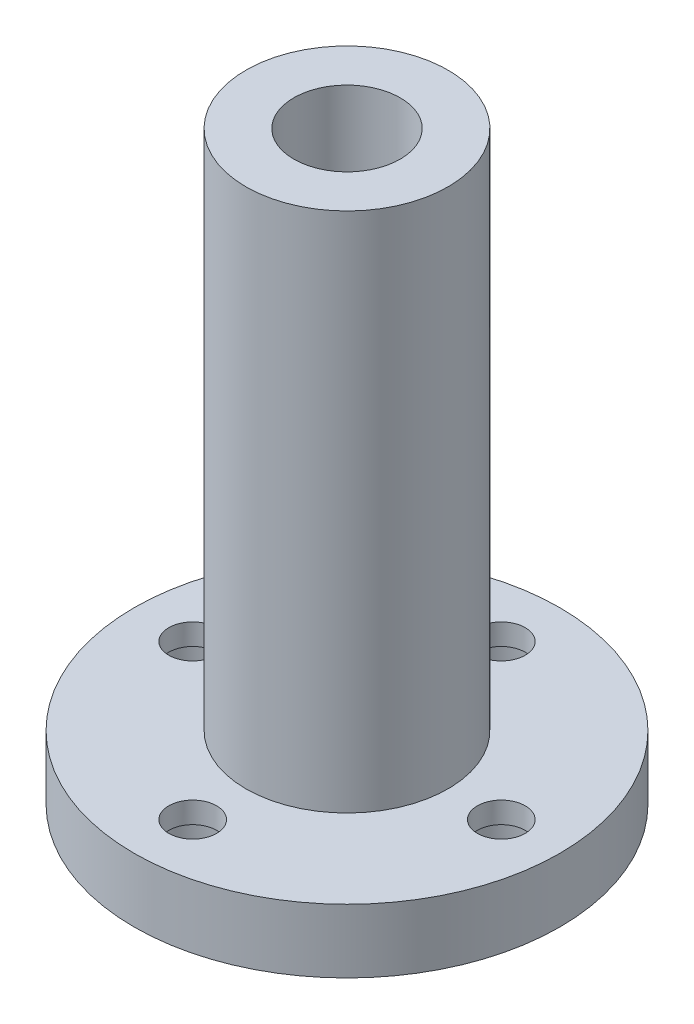
ISO-10303-21;
HEADER;
FILE_DESCRIPTION(('STEP AP214'),'2;1');
FILE_NAME('part.step','',(''),(''),'','','');
FILE_SCHEMA(('AUTOMOTIVE_DESIGN { 1 0 10303 214 1 1 1 1 }'));
ENDSEC;
DATA;
#1=APPLICATION_CONTEXT('core data for automotive mechanical design processes');
#2=APPLICATION_PROTOCOL_DEFINITION('international standard','automotive_design',2000,#1);
#3=PRODUCT_CONTEXT('',#1,'mechanical');
#4=PRODUCT('Part','Part','',(#3));
#5=PRODUCT_RELATED_PRODUCT_CATEGORY('part','',(#4));
#6=PRODUCT_DEFINITION_FORMATION('','',#4);
#7=PRODUCT_DEFINITION_CONTEXT('part definition',#1,'design');
#8=PRODUCT_DEFINITION('design','',#6,#7);
#9=PRODUCT_DEFINITION_SHAPE('','',#8);
#10=(LENGTH_UNIT() NAMED_UNIT(*) SI_UNIT(.MILLI.,.METRE.));
#11=(NAMED_UNIT(*) PLANE_ANGLE_UNIT() SI_UNIT($,.RADIAN.));
#12=(NAMED_UNIT(*) SI_UNIT($,.STERADIAN.) SOLID_ANGLE_UNIT());
#13=UNCERTAINTY_MEASURE_WITH_UNIT(LENGTH_MEASURE(1.E-05),#10,'distance_accuracy_value','');
#14=(GEOMETRIC_REPRESENTATION_CONTEXT(3) GLOBAL_UNCERTAINTY_ASSIGNED_CONTEXT((#13)) GLOBAL_UNIT_ASSIGNED_CONTEXT((#10,
#11,#12)) REPRESENTATION_CONTEXT('',''));
#15=CARTESIAN_POINT('',(0.,0.,0.));
#16=DIRECTION('',(0.,0.,1.));
#17=DIRECTION('',(1.,0.,0.));
#18=AXIS2_PLACEMENT_3D('',#15,#16,#17);
#19=CARTESIAN_POINT('',(0.,0.,-14.5));
#20=DIRECTION('',(0.,1.,0.));
#21=DIRECTION('',(0.,0.,1.));
#22=AXIS2_PLACEMENT_3D('',#19,#20,#21);
#23=CYLINDRICAL_SURFACE('',#22,2.25);
#24=CARTESIAN_POINT('',(0.,6.,-14.5));
#25=DIRECTION('',(0.,1.,0.));
#26=DIRECTION('',(0.,0.,1.));
#27=AXIS2_PLACEMENT_3D('',#24,#25,#26);
#28=CIRCLE('',#27,2.25);
#29=CARTESIAN_POINT('',(0.,6.,-12.25));
#30=VERTEX_POINT('',#29);
#31=EDGE_CURVE('E52',#30,#30,#28,.T.);
#32=ORIENTED_EDGE('',*,*,#31,.T.);
#33=EDGE_LOOP('',(#32));
#34=FACE_BOUND('',#33,.T.);
#35=CARTESIAN_POINT('',(0.,4.,-14.5));
#36=DIRECTION('',(0.,-1.,0.));
#37=DIRECTION('',(0.,0.,-1.));
#38=AXIS2_PLACEMENT_3D('',#35,#36,#37);
#39=CIRCLE('',#38,2.25);
#40=CARTESIAN_POINT('',(0.,4.,-16.75));
#41=VERTEX_POINT('',#40);
#42=EDGE_CURVE('E36',#41,#41,#39,.F.);
#43=ORIENTED_EDGE('',*,*,#42,.F.);
#44=EDGE_LOOP('',(#43));
#45=FACE_BOUND('',#44,.T.);
#46=ADVANCED_FACE('F32',(#34,#45),#23,.F.);
#47=CARTESIAN_POINT('',(14.5,0.,0.));
#48=DIRECTION('',(0.,1.,0.));
#49=DIRECTION('',(0.,0.,1.));
#50=AXIS2_PLACEMENT_3D('',#47,#48,#49);
#51=CYLINDRICAL_SURFACE('',#50,2.25);
#52=CARTESIAN_POINT('',(14.5,6.,0.));
#53=DIRECTION('',(0.,1.,0.));
#54=DIRECTION('',(0.,0.,1.));
#55=AXIS2_PLACEMENT_3D('',#52,#53,#54);
#56=CIRCLE('',#55,2.25);
#57=CARTESIAN_POINT('',(14.5,6.,2.25));
#58=VERTEX_POINT('',#57);
#59=EDGE_CURVE('E91',#58,#58,#56,.T.);
#60=ORIENTED_EDGE('',*,*,#59,.T.);
#61=EDGE_LOOP('',(#60));
#62=FACE_BOUND('',#61,.T.);
#63=CARTESIAN_POINT('',(14.5,4.,0.));
#64=DIRECTION('',(0.,-1.,0.));
#65=DIRECTION('',(0.,0.,-1.));
#66=AXIS2_PLACEMENT_3D('',#63,#64,#65);
#67=CIRCLE('',#66,2.25);
#68=CARTESIAN_POINT('',(14.5,4.,-2.25));
#69=VERTEX_POINT('',#68);
#70=EDGE_CURVE('E58',#69,#69,#67,.F.);
#71=ORIENTED_EDGE('',*,*,#70,.F.);
#72=EDGE_LOOP('',(#71));
#73=FACE_BOUND('',#72,.T.);
#74=ADVANCED_FACE('F122',(#62,#73),#51,.F.);
#75=CARTESIAN_POINT('',(0.,0.,14.5));
#76=DIRECTION('',(0.,1.,0.));
#77=DIRECTION('',(0.,0.,1.));
#78=AXIS2_PLACEMENT_3D('',#75,#76,#77);
#79=CYLINDRICAL_SURFACE('',#78,2.25);
#80=CARTESIAN_POINT('',(0.,6.,14.5));
#81=DIRECTION('',(0.,1.,0.));
#82=DIRECTION('',(0.,0.,1.));
#83=AXIS2_PLACEMENT_3D('',#80,#81,#82);
#84=CIRCLE('',#83,2.25);
#85=CARTESIAN_POINT('',(0.,6.,16.75));
#86=VERTEX_POINT('',#85);
#87=EDGE_CURVE('E88',#86,#86,#84,.T.);
#88=ORIENTED_EDGE('',*,*,#87,.T.);
#89=EDGE_LOOP('',(#88));
#90=FACE_BOUND('',#89,.T.);
#91=CARTESIAN_POINT('',(0.,4.,14.5));
#92=DIRECTION('',(0.,-1.,0.));
#93=DIRECTION('',(0.,0.,-1.));
#94=AXIS2_PLACEMENT_3D('',#91,#92,#93);
#95=CIRCLE('',#94,2.25);
#96=CARTESIAN_POINT('',(0.,4.,12.25));
#97=VERTEX_POINT('',#96);
#98=EDGE_CURVE('E54',#97,#97,#95,.F.);
#99=ORIENTED_EDGE('',*,*,#98,.F.);
#100=EDGE_LOOP('',(#99));
#101=FACE_BOUND('',#100,.T.);
#102=ADVANCED_FACE('F128',(#90,#101),#79,.F.);
#103=CARTESIAN_POINT('',(-14.5,0.,0.));
#104=DIRECTION('',(0.,1.,0.));
#105=DIRECTION('',(0.,0.,1.));
#106=AXIS2_PLACEMENT_3D('',#103,#104,#105);
#107=CYLINDRICAL_SURFACE('',#106,2.25);
#108=CARTESIAN_POINT('',(-14.5,6.,0.));
#109=DIRECTION('',(0.,1.,0.));
#110=DIRECTION('',(0.,0.,1.));
#111=AXIS2_PLACEMENT_3D('',#108,#109,#110);
#112=CIRCLE('',#111,2.25);
#113=CARTESIAN_POINT('',(-14.5,6.,2.25));
#114=VERTEX_POINT('',#113);
#115=EDGE_CURVE('E85',#114,#114,#112,.T.);
#116=ORIENTED_EDGE('',*,*,#115,.T.);
#117=EDGE_LOOP('',(#116));
#118=FACE_BOUND('',#117,.T.);
#119=CARTESIAN_POINT('',(-14.5,4.,0.));
#120=DIRECTION('',(0.,-1.,0.));
#121=DIRECTION('',(0.,0.,-1.));
#122=AXIS2_PLACEMENT_3D('',#119,#120,#121);
#123=CIRCLE('',#122,2.25);
#124=CARTESIAN_POINT('',(-14.5,4.,-2.25));
#125=VERTEX_POINT('',#124);
#126=EDGE_CURVE('E49',#125,#125,#123,.F.);
#127=ORIENTED_EDGE('',*,*,#126,.F.);
#128=EDGE_LOOP('',(#127));
#129=FACE_BOUND('',#128,.T.);
#130=ADVANCED_FACE('F119',(#118,#129),#107,.F.);
#131=CARTESIAN_POINT('',(9.50000000000001,55.,0.));
#132=DIRECTION('',(0.,-1.,0.));
#133=DIRECTION('',(0.,0.,-1.));
#134=AXIS2_PLACEMENT_3D('',#131,#132,#133);
#135=PLANE('',#134);
#136=CARTESIAN_POINT('',(0.,55.,0.));
#137=DIRECTION('',(0.,1.,0.));
#138=DIRECTION('',(0.,0.,1.));
#139=AXIS2_PLACEMENT_3D('',#136,#137,#138);
#140=CIRCLE('',#139,5.);
#141=CARTESIAN_POINT('',(0.,55.,5.));
#142=VERTEX_POINT('',#141);
#143=EDGE_CURVE('E10',#142,#142,#140,.T.);
#144=ORIENTED_EDGE('',*,*,#143,.F.);
#145=EDGE_LOOP('',(#144));
#146=FACE_BOUND('',#145,.T.);
#147=CARTESIAN_POINT('',(0.,55.,0.));
#148=DIRECTION('',(0.,1.,0.));
#149=DIRECTION('',(0.,0.,1.));
#150=AXIS2_PLACEMENT_3D('',#147,#148,#149);
#151=CIRCLE('',#150,9.50000000000001);
#152=CARTESIAN_POINT('',(0.,55.,9.50000000000001));
#153=VERTEX_POINT('',#152);
#154=EDGE_CURVE('E94',#153,#153,#151,.T.);
#155=ORIENTED_EDGE('',*,*,#154,.T.);
#156=EDGE_LOOP('',(#155));
#157=FACE_BOUND('',#156,.T.);
#158=ADVANCED_FACE('F34',(#146,#157),#135,.F.);
#159=CARTESIAN_POINT('',(0.,53.5809531732792,0.));
#160=DIRECTION('',(0.,1.,0.));
#161=DIRECTION('',(0.,0.,1.));
#162=AXIS2_PLACEMENT_3D('',#159,#160,#161);
#163=CYLINDRICAL_SURFACE('',#162,5.);
#164=CARTESIAN_POINT('',(0.,0.,0.));
#165=DIRECTION('',(0.,1.,0.));
#166=DIRECTION('',(0.,0.,1.));
#167=AXIS2_PLACEMENT_3D('',#164,#165,#166);
#168=CIRCLE('',#167,5.00000000000001);
#169=CARTESIAN_POINT('',(0.,0.,5.00000000000001));
#170=VERTEX_POINT('',#169);
#171=EDGE_CURVE('E40',#170,#170,#168,.T.);
#172=ORIENTED_EDGE('',*,*,#171,.F.);
#173=EDGE_LOOP('',(#172));
#174=FACE_BOUND('',#173,.T.);
#175=ORIENTED_EDGE('',*,*,#143,.T.);
#176=EDGE_LOOP('',(#175));
#177=FACE_BOUND('',#176,.T.);
#178=ADVANCED_FACE('F110',(#174,#177),#163,.F.);
#179=CARTESIAN_POINT('',(5.00000000000001,0.,0.));
#180=DIRECTION('',(0.,1.,0.));
#181=DIRECTION('',(0.,0.,1.));
#182=AXIS2_PLACEMENT_3D('',#179,#180,#181);
#183=PLANE('',#182);
#184=CARTESIAN_POINT('',(0.,0.,-14.5));
#185=DIRECTION('',(0.,-1.,0.));
#186=DIRECTION('',(0.,0.,-1.));
#187=AXIS2_PLACEMENT_3D('',#184,#185,#186);
#188=CIRCLE('',#187,3.75);
#189=CARTESIAN_POINT('',(0.,0.,-18.25));
#190=VERTEX_POINT('',#189);
#191=EDGE_CURVE('E74',#190,#190,#188,.T.);
#192=ORIENTED_EDGE('',*,*,#191,.F.);
#193=EDGE_LOOP('',(#192));
#194=FACE_BOUND('',#193,.T.);
#195=CARTESIAN_POINT('',(14.5,0.,0.));
#196=DIRECTION('',(0.,-1.,0.));
#197=DIRECTION('',(0.,0.,-1.));
#198=AXIS2_PLACEMENT_3D('',#195,#196,#197);
#199=CIRCLE('',#198,3.75);
#200=CARTESIAN_POINT('',(14.5,0.,-3.75));
#201=VERTEX_POINT('',#200);
#202=EDGE_CURVE('E67',#201,#201,#199,.T.);
#203=ORIENTED_EDGE('',*,*,#202,.F.);
#204=EDGE_LOOP('',(#203));
#205=FACE_BOUND('',#204,.T.);
#206=CARTESIAN_POINT('',(0.,0.,14.5));
#207=DIRECTION('',(0.,-1.,0.));
#208=DIRECTION('',(0.,0.,-1.));
#209=AXIS2_PLACEMENT_3D('',#206,#207,#208);
#210=CIRCLE('',#209,3.75);
#211=CARTESIAN_POINT('',(0.,0.,10.75));
#212=VERTEX_POINT('',#211);
#213=EDGE_CURVE('E60',#212,#212,#210,.T.);
#214=ORIENTED_EDGE('',*,*,#213,.F.);
#215=EDGE_LOOP('',(#214));
#216=FACE_BOUND('',#215,.T.);
#217=CARTESIAN_POINT('',(-14.5,0.,0.));
#218=DIRECTION('',(0.,-1.,0.));
#219=DIRECTION('',(0.,0.,-1.));
#220=AXIS2_PLACEMENT_3D('',#217,#218,#219);
#221=CIRCLE('',#220,3.75);
#222=CARTESIAN_POINT('',(-14.5,0.,-3.75));
#223=VERTEX_POINT('',#222);
#224=EDGE_CURVE('E56',#223,#223,#221,.T.);
#225=ORIENTED_EDGE('',*,*,#224,.F.);
#226=EDGE_LOOP('',(#225));
#227=FACE_BOUND('',#226,.T.);
#228=CARTESIAN_POINT('',(0.,0.,0.));
#229=DIRECTION('',(0.,1.,0.));
#230=DIRECTION('',(0.,0.,1.));
#231=AXIS2_PLACEMENT_3D('',#228,#229,#230);
#232=CIRCLE('',#231,20.);
#233=CARTESIAN_POINT('',(0.,0.,20.));
#234=VERTEX_POINT('',#233);
#235=EDGE_CURVE('E45',#234,#234,#232,.T.);
#236=ORIENTED_EDGE('',*,*,#235,.F.);
#237=EDGE_LOOP('',(#236));
#238=FACE_BOUND('',#237,.T.);
#239=ORIENTED_EDGE('',*,*,#171,.T.);
#240=EDGE_LOOP('',(#239));
#241=FACE_BOUND('',#240,.T.);
#242=ADVANCED_FACE('F107',(#194,#205,#216,#227,#238,#241),#183,.F.);
#243=CARTESIAN_POINT('',(0.,53.5809531732792,0.));
#244=DIRECTION('',(0.,1.,0.));
#245=DIRECTION('',(0.,0.,1.));
#246=AXIS2_PLACEMENT_3D('',#243,#244,#245);
#247=CYLINDRICAL_SURFACE('',#246,20.);
#248=CARTESIAN_POINT('',(0.,6.00000000000001,0.));
#249=DIRECTION('',(0.,1.,0.));
#250=DIRECTION('',(0.,0.,1.));
#251=AXIS2_PLACEMENT_3D('',#248,#249,#250);
#252=CIRCLE('',#251,20.);
#253=CARTESIAN_POINT('',(0.,6.00000000000001,20.));
#254=VERTEX_POINT('',#253);
#255=EDGE_CURVE('E100',#254,#254,#252,.T.);
#256=ORIENTED_EDGE('',*,*,#255,.F.);
#257=EDGE_LOOP('',(#256));
#258=FACE_BOUND('',#257,.T.);
#259=ORIENTED_EDGE('',*,*,#235,.T.);
#260=EDGE_LOOP('',(#259));
#261=FACE_BOUND('',#260,.T.);
#262=ADVANCED_FACE('F105',(#258,#261),#247,.T.);
#263=CARTESIAN_POINT('',(20.,6.,0.));
#264=DIRECTION('',(0.,-1.,0.));
#265=DIRECTION('',(0.,0.,-1.));
#266=AXIS2_PLACEMENT_3D('',#263,#264,#265);
#267=PLANE('',#266);
#268=ORIENTED_EDGE('',*,*,#31,.F.);
#269=EDGE_LOOP('',(#268));
#270=FACE_BOUND('',#269,.T.);
#271=ORIENTED_EDGE('',*,*,#115,.F.);
#272=EDGE_LOOP('',(#271));
#273=FACE_BOUND('',#272,.T.);
#274=ORIENTED_EDGE('',*,*,#87,.F.);
#275=EDGE_LOOP('',(#274));
#276=FACE_BOUND('',#275,.T.);
#277=ORIENTED_EDGE('',*,*,#59,.F.);
#278=EDGE_LOOP('',(#277));
#279=FACE_BOUND('',#278,.T.);
#280=CARTESIAN_POINT('',(0.,6.,0.));
#281=DIRECTION('',(0.,1.,0.));
#282=DIRECTION('',(0.,0.,1.));
#283=AXIS2_PLACEMENT_3D('',#280,#281,#282);
#284=CIRCLE('',#283,9.50000000000001);
#285=CARTESIAN_POINT('',(0.,6.,9.50000000000001));
#286=VERTEX_POINT('',#285);
#287=EDGE_CURVE('E97',#286,#286,#284,.T.);
#288=ORIENTED_EDGE('',*,*,#287,.F.);
#289=EDGE_LOOP('',(#288));
#290=FACE_BOUND('',#289,.T.);
#291=ORIENTED_EDGE('',*,*,#255,.T.);
#292=EDGE_LOOP('',(#291));
#293=FACE_BOUND('',#292,.T.);
#294=ADVANCED_FACE('F146',(#270,#273,#276,#279,#290,#293),#267,.F.);
#295=CARTESIAN_POINT('',(0.,53.5809531732792,0.));
#296=DIRECTION('',(0.,1.,0.));
#297=DIRECTION('',(0.,0.,1.));
#298=AXIS2_PLACEMENT_3D('',#295,#296,#297);
#299=CYLINDRICAL_SURFACE('',#298,9.50000000000001);
#300=ORIENTED_EDGE('',*,*,#154,.F.);
#301=EDGE_LOOP('',(#300));
#302=FACE_BOUND('',#301,.T.);
#303=ORIENTED_EDGE('',*,*,#287,.T.);
#304=EDGE_LOOP('',(#303));
#305=FACE_BOUND('',#304,.T.);
#306=ADVANCED_FACE('F142',(#302,#305),#299,.T.);
#307=CARTESIAN_POINT('',(-14.5,4.,0.));
#308=DIRECTION('',(0.,-1.,0.));
#309=DIRECTION('',(0.,0.,-1.));
#310=AXIS2_PLACEMENT_3D('',#307,#308,#309);
#311=PLANE('',#310);
#312=CARTESIAN_POINT('',(-14.5,4.,0.));
#313=DIRECTION('',(0.,-1.,0.));
#314=DIRECTION('',(0.,0.,-1.));
#315=AXIS2_PLACEMENT_3D('',#312,#313,#314);
#316=CIRCLE('',#315,3.75);
#317=CARTESIAN_POINT('',(-14.5,4.,-3.75));
#318=VERTEX_POINT('',#317);
#319=EDGE_CURVE('E53',#318,#318,#316,.T.);
#320=ORIENTED_EDGE('',*,*,#319,.T.);
#321=EDGE_LOOP('',(#320));
#322=FACE_BOUND('',#321,.T.);
#323=ORIENTED_EDGE('',*,*,#126,.T.);
#324=EDGE_LOOP('',(#323));
#325=FACE_BOUND('',#324,.T.);
#326=ADVANCED_FACE('F145',(#322,#325),#311,.T.);
#327=CARTESIAN_POINT('',(-14.5,4.,0.));
#328=DIRECTION('',(0.,-1.,0.));
#329=DIRECTION('',(0.,0.,-1.));
#330=AXIS2_PLACEMENT_3D('',#327,#328,#329);
#331=CYLINDRICAL_SURFACE('',#330,3.75);
#332=ORIENTED_EDGE('',*,*,#319,.F.);
#333=EDGE_LOOP('',(#332));
#334=FACE_BOUND('',#333,.T.);
#335=ORIENTED_EDGE('',*,*,#224,.T.);
#336=EDGE_LOOP('',(#335));
#337=FACE_BOUND('',#336,.T.);
#338=ADVANCED_FACE('F134',(#334,#337),#331,.F.);
#339=CARTESIAN_POINT('',(0.,4.,14.5));
#340=DIRECTION('',(0.,-1.,0.));
#341=DIRECTION('',(0.,0.,-1.));
#342=AXIS2_PLACEMENT_3D('',#339,#340,#341);
#343=PLANE('',#342);
#344=CARTESIAN_POINT('',(0.,4.,14.5));
#345=DIRECTION('',(0.,-1.,0.));
#346=DIRECTION('',(0.,0.,-1.));
#347=AXIS2_PLACEMENT_3D('',#344,#345,#346);
#348=CIRCLE('',#347,3.75);
#349=CARTESIAN_POINT('',(0.,4.,10.75));
#350=VERTEX_POINT('',#349);
#351=EDGE_CURVE('E57',#350,#350,#348,.T.);
#352=ORIENTED_EDGE('',*,*,#351,.T.);
#353=EDGE_LOOP('',(#352));
#354=FACE_BOUND('',#353,.T.);
#355=ORIENTED_EDGE('',*,*,#98,.T.);
#356=EDGE_LOOP('',(#355));
#357=FACE_BOUND('',#356,.T.);
#358=ADVANCED_FACE('F179',(#354,#357),#343,.T.);
#359=CARTESIAN_POINT('',(0.,4.,14.5));
#360=DIRECTION('',(0.,-1.,0.));
#361=DIRECTION('',(0.,0.,-1.));
#362=AXIS2_PLACEMENT_3D('',#359,#360,#361);
#363=CYLINDRICAL_SURFACE('',#362,3.75);
#364=ORIENTED_EDGE('',*,*,#351,.F.);
#365=EDGE_LOOP('',(#364));
#366=FACE_BOUND('',#365,.T.);
#367=ORIENTED_EDGE('',*,*,#213,.T.);
#368=EDGE_LOOP('',(#367));
#369=FACE_BOUND('',#368,.T.);
#370=ADVANCED_FACE('F186',(#366,#369),#363,.F.);
#371=CARTESIAN_POINT('',(14.5,4.,0.));
#372=DIRECTION('',(0.,-1.,0.));
#373=DIRECTION('',(0.,0.,-1.));
#374=AXIS2_PLACEMENT_3D('',#371,#372,#373);
#375=PLANE('',#374);
#376=CARTESIAN_POINT('',(14.5,4.,0.));
#377=DIRECTION('',(0.,-1.,0.));
#378=DIRECTION('',(0.,0.,-1.));
#379=AXIS2_PLACEMENT_3D('',#376,#377,#378);
#380=CIRCLE('',#379,3.75);
#381=CARTESIAN_POINT('',(14.5,4.,-3.75));
#382=VERTEX_POINT('',#381);
#383=EDGE_CURVE('E61',#382,#382,#380,.T.);
#384=ORIENTED_EDGE('',*,*,#383,.T.);
#385=EDGE_LOOP('',(#384));
#386=FACE_BOUND('',#385,.T.);
#387=ORIENTED_EDGE('',*,*,#70,.T.);
#388=EDGE_LOOP('',(#387));
#389=FACE_BOUND('',#388,.T.);
#390=ADVANCED_FACE('F194',(#386,#389),#375,.T.);
#391=CARTESIAN_POINT('',(14.5,4.,0.));
#392=DIRECTION('',(0.,-1.,0.));
#393=DIRECTION('',(0.,0.,-1.));
#394=AXIS2_PLACEMENT_3D('',#391,#392,#393);
#395=CYLINDRICAL_SURFACE('',#394,3.75);
#396=ORIENTED_EDGE('',*,*,#383,.F.);
#397=EDGE_LOOP('',(#396));
#398=FACE_BOUND('',#397,.T.);
#399=ORIENTED_EDGE('',*,*,#202,.T.);
#400=EDGE_LOOP('',(#399));
#401=FACE_BOUND('',#400,.T.);
#402=ADVANCED_FACE('F202',(#398,#401),#395,.F.);
#403=CARTESIAN_POINT('',(0.,4.,-14.5));
#404=DIRECTION('',(0.,-1.,0.));
#405=DIRECTION('',(0.,0.,-1.));
#406=AXIS2_PLACEMENT_3D('',#403,#404,#405);
#407=PLANE('',#406);
#408=CARTESIAN_POINT('',(0.,4.,-14.5));
#409=DIRECTION('',(0.,-1.,0.));
#410=DIRECTION('',(0.,0.,-1.));
#411=AXIS2_PLACEMENT_3D('',#408,#409,#410);
#412=CIRCLE('',#411,3.75);
#413=CARTESIAN_POINT('',(0.,4.,-18.25));
#414=VERTEX_POINT('',#413);
#415=EDGE_CURVE('E289',#414,#414,#412,.T.);
#416=ORIENTED_EDGE('',*,*,#415,.T.);
#417=EDGE_LOOP('',(#416));
#418=FACE_BOUND('',#417,.T.);
#419=ORIENTED_EDGE('',*,*,#42,.T.);
#420=EDGE_LOOP('',(#419));
#421=FACE_BOUND('',#420,.T.);
#422=ADVANCED_FACE('F209',(#418,#421),#407,.T.);
#423=CARTESIAN_POINT('',(0.,4.,-14.5));
#424=DIRECTION('',(0.,-1.,0.));
#425=DIRECTION('',(0.,0.,-1.));
#426=AXIS2_PLACEMENT_3D('',#423,#424,#425);
#427=CYLINDRICAL_SURFACE('',#426,3.75);
#428=ORIENTED_EDGE('',*,*,#415,.F.);
#429=EDGE_LOOP('',(#428));
#430=FACE_BOUND('',#429,.T.);
#431=ORIENTED_EDGE('',*,*,#191,.T.);
#432=EDGE_LOOP('',(#431));
#433=FACE_BOUND('',#432,.T.);
#434=ADVANCED_FACE('F217',(#430,#433),#427,.F.);
#435=CLOSED_SHELL('',(#46,#74,#102,#130,#158,#178,#242,#262,#294,#306,#326,#338,#358,#370,#390,
#402,#422,#434));
#436=MANIFOLD_SOLID_BREP('B2',#435);
#437=ADVANCED_BREP_SHAPE_REPRESENTATION('',(#18,#436),#14);
#438=SHAPE_DEFINITION_REPRESENTATION(#9,#437);
ENDSEC;
END-ISO-10303-21;
